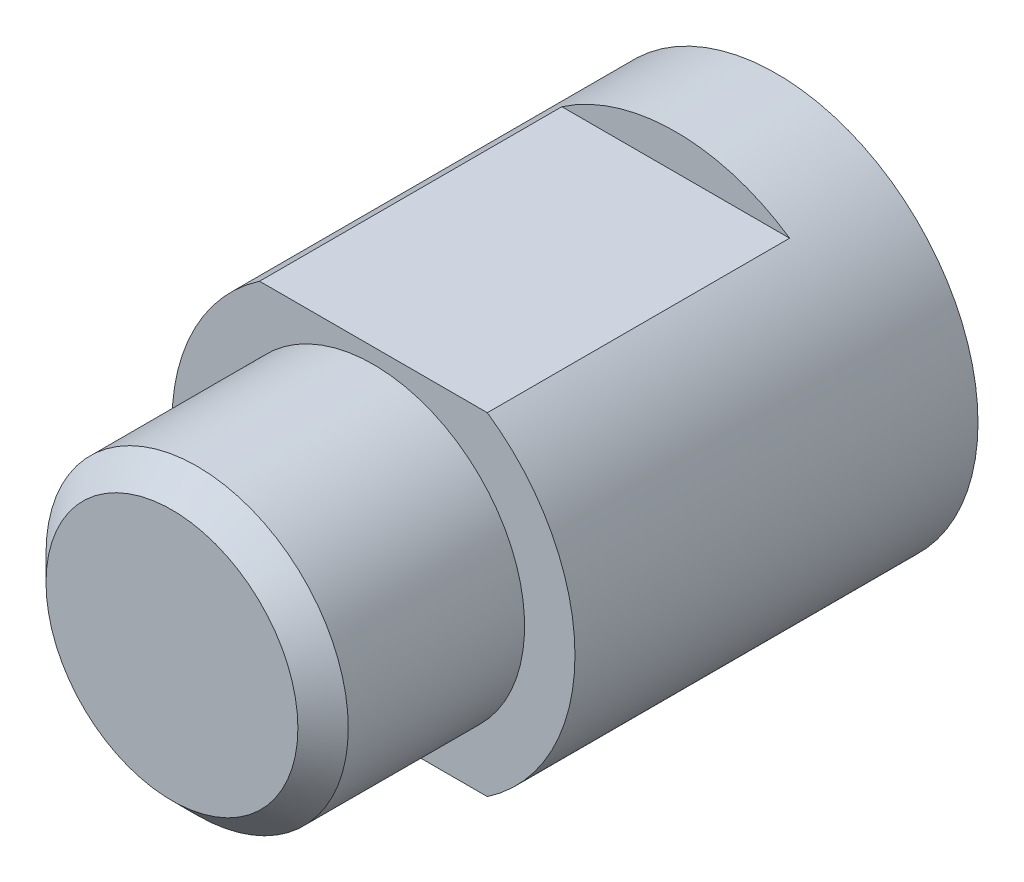
ISO-10303-21;
HEADER;
FILE_DESCRIPTION(('STEP AP214'),'2;1');
FILE_NAME('part.step','',(''),(''),'','','');
FILE_SCHEMA(('AUTOMOTIVE_DESIGN { 1 0 10303 214 1 1 1 1 }'));
ENDSEC;
DATA;
#1=APPLICATION_CONTEXT('core data for automotive mechanical design processes');
#2=APPLICATION_PROTOCOL_DEFINITION('international standard','automotive_design',2000,#1);
#3=PRODUCT_CONTEXT('',#1,'mechanical');
#4=PRODUCT('Part','Part','',(#3));
#5=PRODUCT_RELATED_PRODUCT_CATEGORY('part','',(#4));
#6=PRODUCT_DEFINITION_FORMATION('','',#4);
#7=PRODUCT_DEFINITION_CONTEXT('part definition',#1,'design');
#8=PRODUCT_DEFINITION('design','',#6,#7);
#9=PRODUCT_DEFINITION_SHAPE('','',#8);
#10=(LENGTH_UNIT() NAMED_UNIT(*) SI_UNIT(.MILLI.,.METRE.));
#11=(NAMED_UNIT(*) PLANE_ANGLE_UNIT() SI_UNIT($,.RADIAN.));
#12=(NAMED_UNIT(*) SI_UNIT($,.STERADIAN.) SOLID_ANGLE_UNIT());
#13=UNCERTAINTY_MEASURE_WITH_UNIT(LENGTH_MEASURE(1.E-05),#10,'distance_accuracy_value','');
#14=(GEOMETRIC_REPRESENTATION_CONTEXT(3) GLOBAL_UNCERTAINTY_ASSIGNED_CONTEXT((#13)) GLOBAL_UNIT_ASSIGNED_CONTEXT((#10,
#11,#12)) REPRESENTATION_CONTEXT('',''));
#15=CARTESIAN_POINT('',(0.,0.,0.));
#16=DIRECTION('',(0.,0.,1.));
#17=DIRECTION('',(1.,0.,0.));
#18=AXIS2_PLACEMENT_3D('',#15,#16,#17);
#19=CARTESIAN_POINT('',(0.,0.,4.));
#20=DIRECTION('',(0.,0.,-1.));
#21=DIRECTION('',(-1.,0.,0.));
#22=AXIS2_PLACEMENT_3D('',#19,#20,#21);
#23=CYLINDRICAL_SURFACE('',#22,3.);
#24=CARTESIAN_POINT('',(0.,0.,3.5));
#25=DIRECTION('',(0.,0.,1.));
#26=DIRECTION('',(1.,0.,0.));
#27=AXIS2_PLACEMENT_3D('',#24,#25,#26);
#28=CIRCLE('',#27,3.);
#29=CARTESIAN_POINT('',(3.,0.,3.5));
#30=VERTEX_POINT('',#29);
#31=EDGE_CURVE('E115',#30,#30,#28,.F.);
#32=ORIENTED_EDGE('',*,*,#31,.T.);
#33=EDGE_LOOP('',(#32));
#34=FACE_BOUND('',#33,.T.);
#35=CARTESIAN_POINT('',(0.,0.,0.));
#36=DIRECTION('',(0.,0.,-1.));
#37=DIRECTION('',(-1.,0.,0.));
#38=AXIS2_PLACEMENT_3D('',#35,#36,#37);
#39=CIRCLE('',#38,3.);
#40=CARTESIAN_POINT('',(-3.,0.,0.));
#41=VERTEX_POINT('',#40);
#42=EDGE_CURVE('E121',#41,#41,#39,.T.);
#43=ORIENTED_EDGE('',*,*,#42,.F.);
#44=EDGE_LOOP('',(#43));
#45=FACE_BOUND('',#44,.T.);
#46=ADVANCED_FACE('F48',(#34,#45),#23,.T.);
#47=CARTESIAN_POINT('',(0.,0.,4.));
#48=DIRECTION('',(0.,0.,1.));
#49=DIRECTION('',(1.,0.,0.));
#50=AXIS2_PLACEMENT_3D('',#47,#48,#49);
#51=PLANE('',#50);
#52=CARTESIAN_POINT('',(0.,0.,4.));
#53=DIRECTION('',(0.,0.,1.));
#54=DIRECTION('',(1.,0.,0.));
#55=AXIS2_PLACEMENT_3D('',#52,#53,#54);
#56=CIRCLE('',#55,2.5);
#57=CARTESIAN_POINT('',(2.5,0.,4.));
#58=VERTEX_POINT('',#57);
#59=EDGE_CURVE('E118',#58,#58,#56,.T.);
#60=ORIENTED_EDGE('',*,*,#59,.T.);
#61=EDGE_LOOP('',(#60));
#62=FACE_BOUND('',#61,.T.);
#63=ADVANCED_FACE('F159',(#62),#51,.T.);
#64=CARTESIAN_POINT('',(0.,0.,4.));
#65=DIRECTION('',(0.,0.,-1.));
#66=DIRECTION('',(-1.,0.,0.));
#67=AXIS2_PLACEMENT_3D('',#64,#65,#66);
#68=CONICAL_SURFACE('',#67,2.5,0.785398163397446);
#69=ORIENTED_EDGE('',*,*,#31,.F.);
#70=EDGE_LOOP('',(#69));
#71=FACE_BOUND('',#70,.T.);
#72=ORIENTED_EDGE('',*,*,#59,.F.);
#73=EDGE_LOOP('',(#72));
#74=FACE_BOUND('',#73,.T.);
#75=ADVANCED_FACE('F50',(#71,#74),#68,.T.);
#76=CARTESIAN_POINT('',(0.,0.,0.));
#77=DIRECTION('',(0.,0.,-1.));
#78=DIRECTION('',(-1.,0.,0.));
#79=AXIS2_PLACEMENT_3D('',#76,#77,#78);
#80=PLANE('',#79);
#81=CARTESIAN_POINT('',(0.,0.,0.));
#82=DIRECTION('',(0.,0.,-1.));
#83=DIRECTION('',(-1.,0.,0.));
#84=AXIS2_PLACEMENT_3D('',#81,#82,#83);
#85=CIRCLE('',#84,4.);
#86=CARTESIAN_POINT('',(-2.26053091109146,-3.3,0.));
#87=VERTEX_POINT('',#86);
#88=CARTESIAN_POINT('',(-2.26053091109146,3.3,0.));
#89=VERTEX_POINT('',#88);
#90=EDGE_CURVE('E126',#87,#89,#85,.T.);
#91=ORIENTED_EDGE('',*,*,#90,.F.);
#92=DIRECTION('',(1.,0.,0.));
#93=VECTOR('',#92,1.);
#94=CARTESIAN_POINT('',(0.,-3.3,0.));
#95=LINE('',#94,#93);
#96=CARTESIAN_POINT('',(2.26053091109146,-3.3,0.));
#97=VERTEX_POINT('',#96);
#98=EDGE_CURVE('E100',#87,#97,#95,.T.);
#99=ORIENTED_EDGE('',*,*,#98,.T.);
#100=CARTESIAN_POINT('',(2.26053091109146,3.3,0.));
#101=VERTEX_POINT('',#100);
#102=EDGE_CURVE('E106',#101,#97,#85,.T.);
#103=ORIENTED_EDGE('',*,*,#102,.F.);
#104=DIRECTION('',(-1.,0.,0.));
#105=VECTOR('',#104,1.);
#106=CARTESIAN_POINT('',(0.,3.3,0.));
#107=LINE('',#106,#105);
#108=EDGE_CURVE('E135',#101,#89,#107,.T.);
#109=ORIENTED_EDGE('',*,*,#108,.T.);
#110=EDGE_LOOP('',(#91,#99,#103,#109));
#111=FACE_BOUND('',#110,.T.);
#112=ORIENTED_EDGE('',*,*,#42,.T.);
#113=EDGE_LOOP('',(#112));
#114=FACE_BOUND('',#113,.T.);
#115=ADVANCED_FACE('F141',(#111,#114),#80,.F.);
#116=CARTESIAN_POINT('',(0.,0.,-8.));
#117=DIRECTION('',(0.,0.,1.));
#118=DIRECTION('',(1.,0.,0.));
#119=AXIS2_PLACEMENT_3D('',#116,#117,#118);
#120=CYLINDRICAL_SURFACE('',#119,4.);
#121=CARTESIAN_POINT('',(0.,0.,-8.));
#122=DIRECTION('',(0.,0.,-1.));
#123=DIRECTION('',(-1.,0.,0.));
#124=AXIS2_PLACEMENT_3D('',#121,#122,#123);
#125=CIRCLE('',#124,4.);
#126=CARTESIAN_POINT('',(-4.,0.,-8.));
#127=VERTEX_POINT('',#126);
#128=EDGE_CURVE('E124',#127,#127,#125,.T.);
#129=ORIENTED_EDGE('',*,*,#128,.F.);
#130=EDGE_LOOP('',(#129));
#131=FACE_BOUND('',#130,.T.);
#132=CARTESIAN_POINT('',(0.,0.,-6.));
#133=DIRECTION('',(0.,0.,-1.));
#134=DIRECTION('',(0.,1.,0.));
#135=AXIS2_PLACEMENT_3D('',#132,#133,#134);
#136=CIRCLE('',#135,4.);
#137=CARTESIAN_POINT('',(2.26053091109146,-3.3,-6.));
#138=VERTEX_POINT('',#137);
#139=CARTESIAN_POINT('',(-2.26053091109146,-3.3,-6.));
#140=VERTEX_POINT('',#139);
#141=EDGE_CURVE('E91',#138,#140,#136,.T.);
#142=ORIENTED_EDGE('',*,*,#141,.T.);
#143=DIRECTION('',(0.,0.,1.));
#144=VECTOR('',#143,1.);
#145=CARTESIAN_POINT('',(-2.26053091109146,-3.3,-8.));
#146=LINE('',#145,#144);
#147=EDGE_CURVE('E13',#140,#87,#146,.T.);
#148=ORIENTED_EDGE('',*,*,#147,.T.);
#149=ORIENTED_EDGE('',*,*,#90,.T.);
#150=DIRECTION('',(0.,0.,1.));
#151=VECTOR('',#150,1.);
#152=CARTESIAN_POINT('',(-2.26053091109146,3.3,-8.));
#153=LINE('',#152,#151);
#154=CARTESIAN_POINT('',(-2.26053091109146,3.3,-6.));
#155=VERTEX_POINT('',#154);
#156=EDGE_CURVE('E112',#89,#155,#153,.F.);
#157=ORIENTED_EDGE('',*,*,#156,.T.);
#158=CARTESIAN_POINT('',(0.,0.,-6.));
#159=DIRECTION('',(0.,0.,-1.));
#160=DIRECTION('',(-1.,0.,0.));
#161=AXIS2_PLACEMENT_3D('',#158,#159,#160);
#162=CIRCLE('',#161,4.);
#163=CARTESIAN_POINT('',(2.26053091109146,3.3,-6.));
#164=VERTEX_POINT('',#163);
#165=EDGE_CURVE('E109',#155,#164,#162,.T.);
#166=ORIENTED_EDGE('',*,*,#165,.T.);
#167=DIRECTION('',(0.,0.,1.));
#168=VECTOR('',#167,1.);
#169=CARTESIAN_POINT('',(2.26053091109146,3.3,-8.));
#170=LINE('',#169,#168);
#171=EDGE_CURVE('E95',#164,#101,#170,.T.);
#172=ORIENTED_EDGE('',*,*,#171,.T.);
#173=ORIENTED_EDGE('',*,*,#102,.T.);
#174=DIRECTION('',(0.,0.,1.));
#175=VECTOR('',#174,1.);
#176=CARTESIAN_POINT('',(2.26053091109146,-3.3,-8.));
#177=LINE('',#176,#175);
#178=EDGE_CURVE('E56',#97,#138,#177,.F.);
#179=ORIENTED_EDGE('',*,*,#178,.T.);
#180=EDGE_LOOP('',(#142,#148,#149,#157,#166,#172,#173,#179));
#181=FACE_BOUND('',#180,.T.);
#182=ADVANCED_FACE('F103',(#131,#181),#120,.T.);
#183=CARTESIAN_POINT('',(0.,0.,-8.));
#184=DIRECTION('',(0.,0.,-1.));
#185=DIRECTION('',(-1.,0.,0.));
#186=AXIS2_PLACEMENT_3D('',#183,#184,#185);
#187=PLANE('',#186);
#188=CARTESIAN_POINT('',(0.,0.,-8.));
#189=DIRECTION('',(0.,0.,-1.));
#190=DIRECTION('',(-1.,0.,0.));
#191=AXIS2_PLACEMENT_3D('',#188,#189,#190);
#192=CIRCLE('',#191,1.64999999999999);
#193=CARTESIAN_POINT('',(-1.64999999999999,0.,-8.));
#194=VERTEX_POINT('',#193);
#195=EDGE_CURVE('E132',#194,#194,#192,.T.);
#196=ORIENTED_EDGE('',*,*,#195,.F.);
#197=EDGE_LOOP('',(#196));
#198=FACE_BOUND('',#197,.T.);
#199=ORIENTED_EDGE('',*,*,#128,.T.);
#200=EDGE_LOOP('',(#199));
#201=FACE_BOUND('',#200,.T.);
#202=ADVANCED_FACE('F170',(#198,#201),#187,.T.);
#203=CARTESIAN_POINT('',(0.,0.,2.1));
#204=DIRECTION('',(0.,0.,-1.));
#205=DIRECTION('',(-1.,0.,0.));
#206=AXIS2_PLACEMENT_3D('',#203,#204,#205);
#207=CONICAL_SURFACE('',#206,1.64999999999999,1.02974425867665);
#208=CARTESIAN_POINT('',(0.,0.,3.09142002139548));
#209=VERTEX_POINT('',#208);
#210=VERTEX_LOOP('',#209);
#211=FACE_BOUND('',#210,.T.);
#212=CARTESIAN_POINT('',(0.,0.,2.1));
#213=DIRECTION('',(0.,0.,-1.));
#214=DIRECTION('',(-1.,0.,0.));
#215=AXIS2_PLACEMENT_3D('',#212,#213,#214);
#216=CIRCLE('',#215,1.64999999999999);
#217=CARTESIAN_POINT('',(-1.64999999999999,0.,2.1));
#218=VERTEX_POINT('',#217);
#219=EDGE_CURVE('E129',#218,#218,#216,.T.);
#220=ORIENTED_EDGE('',*,*,#219,.T.);
#221=EDGE_LOOP('',(#220));
#222=FACE_BOUND('',#221,.T.);
#223=ADVANCED_FACE('F154',(#211,#222),#207,.F.);
#224=CARTESIAN_POINT('',(0.,0.,-8.));
#225=DIRECTION('',(0.,0.,-1.));
#226=DIRECTION('',(-1.,0.,0.));
#227=AXIS2_PLACEMENT_3D('',#224,#225,#226);
#228=CYLINDRICAL_SURFACE('',#227,1.64999999999999);
#229=ORIENTED_EDGE('',*,*,#219,.F.);
#230=EDGE_LOOP('',(#229));
#231=FACE_BOUND('',#230,.T.);
#232=ORIENTED_EDGE('',*,*,#195,.T.);
#233=EDGE_LOOP('',(#232));
#234=FACE_BOUND('',#233,.T.);
#235=ADVANCED_FACE('F147',(#231,#234),#228,.F.);
#236=CARTESIAN_POINT('',(-4.,5.74004796703222,-6.));
#237=DIRECTION('',(0.,0.,-1.));
#238=DIRECTION('',(-1.,0.,0.));
#239=AXIS2_PLACEMENT_3D('',#236,#237,#238);
#240=PLANE('',#239);
#241=DIRECTION('',(1.,0.,0.));
#242=VECTOR('',#241,1.);
#243=CARTESIAN_POINT('',(-4.,3.3,-6.));
#244=LINE('',#243,#242);
#245=EDGE_CURVE('E70',#155,#164,#244,.T.);
#246=ORIENTED_EDGE('',*,*,#245,.T.);
#247=ORIENTED_EDGE('',*,*,#165,.F.);
#248=EDGE_LOOP('',(#246,#247));
#249=FACE_BOUND('',#248,.T.);
#250=ADVANCED_FACE('F145',(#249),#240,.F.);
#251=CARTESIAN_POINT('',(-4.,3.3,0.665972580482011));
#252=DIRECTION('',(0.,-1.,0.));
#253=DIRECTION('',(0.,0.,-1.));
#254=AXIS2_PLACEMENT_3D('',#251,#252,#253);
#255=PLANE('',#254);
#256=ORIENTED_EDGE('',*,*,#245,.F.);
#257=ORIENTED_EDGE('',*,*,#156,.F.);
#258=ORIENTED_EDGE('',*,*,#108,.F.);
#259=ORIENTED_EDGE('',*,*,#171,.F.);
#260=EDGE_LOOP('',(#256,#257,#258,#259));
#261=FACE_BOUND('',#260,.T.);
#262=ADVANCED_FACE('F143',(#261),#255,.F.);
#263=CARTESIAN_POINT('',(-4.,-3.3,0.665972580482011));
#264=DIRECTION('',(0.,1.,0.));
#265=DIRECTION('',(0.,0.,1.));
#266=AXIS2_PLACEMENT_3D('',#263,#264,#265);
#267=PLANE('',#266);
#268=DIRECTION('',(1.,0.,0.));
#269=VECTOR('',#268,1.);
#270=CARTESIAN_POINT('',(-4.,-3.3,-6.));
#271=LINE('',#270,#269);
#272=EDGE_CURVE('E62',#140,#138,#271,.T.);
#273=ORIENTED_EDGE('',*,*,#272,.T.);
#274=ORIENTED_EDGE('',*,*,#178,.F.);
#275=ORIENTED_EDGE('',*,*,#98,.F.);
#276=ORIENTED_EDGE('',*,*,#147,.F.);
#277=EDGE_LOOP('',(#273,#274,#275,#276));
#278=FACE_BOUND('',#277,.T.);
#279=ADVANCED_FACE('F98',(#278),#267,.F.);
#280=CARTESIAN_POINT('',(-4.,-5.74004796703222,-6.));
#281=DIRECTION('',(0.,0.,-1.));
#282=DIRECTION('',(0.,1.,0.));
#283=AXIS2_PLACEMENT_3D('',#280,#281,#282);
#284=PLANE('',#283);
#285=ORIENTED_EDGE('',*,*,#272,.F.);
#286=ORIENTED_EDGE('',*,*,#141,.F.);
#287=EDGE_LOOP('',(#285,#286));
#288=FACE_BOUND('',#287,.T.);
#289=ADVANCED_FACE('F92',(#288),#284,.F.);
#290=CLOSED_SHELL('',(#46,#63,#75,#115,#182,#202,#223,#235,#250,#262,#279,#289));
#291=MANIFOLD_SOLID_BREP('B2',#290);
#292=ADVANCED_BREP_SHAPE_REPRESENTATION('',(#18,#291),#14);
#293=SHAPE_DEFINITION_REPRESENTATION(#9,#292);
ENDSEC;
END-ISO-10303-21;
